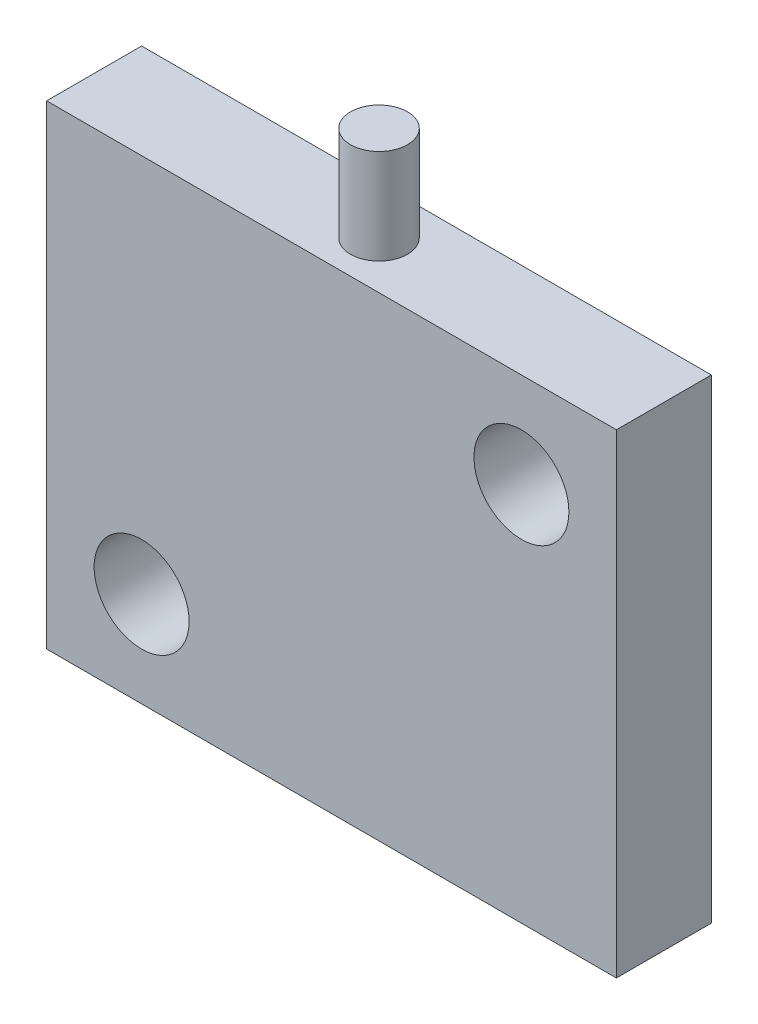
ISO-10303-21;
HEADER;
FILE_DESCRIPTION(('STEP AP214'),'2;1');
FILE_NAME('part.step','',(''),(''),'','','');
FILE_SCHEMA(('AUTOMOTIVE_DESIGN { 1 0 10303 214 1 1 1 1 }'));
ENDSEC;
DATA;
#1=APPLICATION_CONTEXT('core data for automotive mechanical design processes');
#2=APPLICATION_PROTOCOL_DEFINITION('international standard','automotive_design',2000,#1);
#3=PRODUCT_CONTEXT('',#1,'mechanical');
#4=PRODUCT('Part','Part','',(#3));
#5=PRODUCT_RELATED_PRODUCT_CATEGORY('part','',(#4));
#6=PRODUCT_DEFINITION_FORMATION('','',#4);
#7=PRODUCT_DEFINITION_CONTEXT('part definition',#1,'design');
#8=PRODUCT_DEFINITION('design','',#6,#7);
#9=PRODUCT_DEFINITION_SHAPE('','',#8);
#10=(LENGTH_UNIT() NAMED_UNIT(*) SI_UNIT(.MILLI.,.METRE.));
#11=(NAMED_UNIT(*) PLANE_ANGLE_UNIT() SI_UNIT($,.RADIAN.));
#12=(NAMED_UNIT(*) SI_UNIT($,.STERADIAN.) SOLID_ANGLE_UNIT());
#13=UNCERTAINTY_MEASURE_WITH_UNIT(LENGTH_MEASURE(1.E-05),#10,'distance_accuracy_value','');
#14=(GEOMETRIC_REPRESENTATION_CONTEXT(3) GLOBAL_UNCERTAINTY_ASSIGNED_CONTEXT((#13)) GLOBAL_UNIT_ASSIGNED_CONTEXT((#10,
#11,#12)) REPRESENTATION_CONTEXT('',''));
#15=CARTESIAN_POINT('',(0.,0.,0.));
#16=DIRECTION('',(0.,0.,1.));
#17=DIRECTION('',(1.,0.,0.));
#18=AXIS2_PLACEMENT_3D('',#15,#16,#17);
#19=CARTESIAN_POINT('',(30.,30.,10.));
#20=DIRECTION('',(-1.,0.,0.));
#21=DIRECTION('',(0.,-1.,0.));
#22=AXIS2_PLACEMENT_3D('',#19,#20,#21);
#23=PLANE('',#22);
#24=DIRECTION('',(0.,0.,-1.));
#25=VECTOR('',#24,1.);
#26=CARTESIAN_POINT('',(30.,20.,0.));
#27=LINE('',#26,#25);
#28=CARTESIAN_POINT('',(30.,20.,10.));
#29=VERTEX_POINT('',#28);
#30=CARTESIAN_POINT('',(30.,20.,0.));
#31=VERTEX_POINT('',#30);
#32=EDGE_CURVE('E51',#29,#31,#27,.T.);
#33=ORIENTED_EDGE('',*,*,#32,.F.);
#34=DIRECTION('',(0.,1.,0.));
#35=VECTOR('',#34,1.);
#36=CARTESIAN_POINT('',(30.,30.,10.));
#37=LINE('',#36,#35);
#38=CARTESIAN_POINT('',(30.,-30.,10.));
#39=VERTEX_POINT('',#38);
#40=EDGE_CURVE('E80',#39,#29,#37,.T.);
#41=ORIENTED_EDGE('',*,*,#40,.F.);
#42=DIRECTION('',(0.,0.,-1.));
#43=VECTOR('',#42,1.);
#44=CARTESIAN_POINT('',(30.,-30.,10.));
#45=LINE('',#44,#43);
#46=CARTESIAN_POINT('',(30.,-30.,0.));
#47=VERTEX_POINT('',#46);
#48=EDGE_CURVE('E44',#39,#47,#45,.T.);
#49=ORIENTED_EDGE('',*,*,#48,.T.);
#50=DIRECTION('',(0.,1.,0.));
#51=VECTOR('',#50,1.);
#52=CARTESIAN_POINT('',(30.,30.,0.));
#53=LINE('',#52,#51);
#54=EDGE_CURVE('E85',#47,#31,#53,.T.);
#55=ORIENTED_EDGE('',*,*,#54,.T.);
#56=EDGE_LOOP('',(#33,#41,#49,#55));
#57=FACE_BOUND('',#56,.T.);
#58=ADVANCED_FACE('F37',(#57),#23,.F.);
#59=CARTESIAN_POINT('',(-30.,30.,10.));
#60=DIRECTION('',(1.,0.,0.));
#61=DIRECTION('',(0.,1.,0.));
#62=AXIS2_PLACEMENT_3D('',#59,#60,#61);
#63=PLANE('',#62);
#64=DIRECTION('',(0.,0.,1.));
#65=VECTOR('',#64,1.);
#66=CARTESIAN_POINT('',(-30.,20.,0.));
#67=LINE('',#66,#65);
#68=CARTESIAN_POINT('',(-30.,20.,0.));
#69=VERTEX_POINT('',#68);
#70=CARTESIAN_POINT('',(-30.,20.,10.));
#71=VERTEX_POINT('',#70);
#72=EDGE_CURVE('E91',#69,#71,#67,.T.);
#73=ORIENTED_EDGE('',*,*,#72,.F.);
#74=DIRECTION('',(0.,-1.,0.));
#75=VECTOR('',#74,1.);
#76=CARTESIAN_POINT('',(-30.,30.,0.));
#77=LINE('',#76,#75);
#78=CARTESIAN_POINT('',(-30.,-30.,0.));
#79=VERTEX_POINT('',#78);
#80=EDGE_CURVE('E81',#69,#79,#77,.T.);
#81=ORIENTED_EDGE('',*,*,#80,.T.);
#82=DIRECTION('',(0.,0.,-1.));
#83=VECTOR('',#82,1.);
#84=CARTESIAN_POINT('',(-30.,-30.,10.));
#85=LINE('',#84,#83);
#86=CARTESIAN_POINT('',(-30.,-30.,10.));
#87=VERTEX_POINT('',#86);
#88=EDGE_CURVE('E11',#87,#79,#85,.T.);
#89=ORIENTED_EDGE('',*,*,#88,.F.);
#90=DIRECTION('',(0.,-1.,0.));
#91=VECTOR('',#90,1.);
#92=CARTESIAN_POINT('',(-30.,30.,10.));
#93=LINE('',#92,#91);
#94=EDGE_CURVE('E95',#71,#87,#93,.T.);
#95=ORIENTED_EDGE('',*,*,#94,.F.);
#96=EDGE_LOOP('',(#73,#81,#89,#95));
#97=FACE_BOUND('',#96,.T.);
#98=ADVANCED_FACE('F133',(#97),#63,.F.);
#99=CARTESIAN_POINT('',(0.,0.,10.));
#100=DIRECTION('',(0.,0.,1.));
#101=DIRECTION('',(1.,0.,0.));
#102=AXIS2_PLACEMENT_3D('',#99,#100,#101);
#103=PLANE('',#102);
#104=CARTESIAN_POINT('',(20.,10.,10.));
#105=DIRECTION('',(0.,0.,1.));
#106=DIRECTION('',(1.,0.,0.));
#107=AXIS2_PLACEMENT_3D('',#104,#105,#106);
#108=CIRCLE('',#107,5.);
#109=CARTESIAN_POINT('',(25.,10.,10.));
#110=VERTEX_POINT('',#109);
#111=EDGE_CURVE('E115',#110,#110,#108,.T.);
#112=ORIENTED_EDGE('',*,*,#111,.F.);
#113=EDGE_LOOP('',(#112));
#114=FACE_BOUND('',#113,.T.);
#115=CARTESIAN_POINT('',(-20.,-20.,10.));
#116=DIRECTION('',(0.,0.,1.));
#117=DIRECTION('',(1.,0.,0.));
#118=AXIS2_PLACEMENT_3D('',#115,#116,#117);
#119=CIRCLE('',#118,5.);
#120=CARTESIAN_POINT('',(-15.,-20.,10.));
#121=VERTEX_POINT('',#120);
#122=EDGE_CURVE('E112',#121,#121,#119,.T.);
#123=ORIENTED_EDGE('',*,*,#122,.F.);
#124=EDGE_LOOP('',(#123));
#125=FACE_BOUND('',#124,.T.);
#126=ORIENTED_EDGE('',*,*,#40,.T.);
#127=DIRECTION('',(1.,0.,0.));
#128=VECTOR('',#127,1.);
#129=CARTESIAN_POINT('',(0.,20.,10.));
#130=LINE('',#129,#128);
#131=EDGE_CURVE('E88',#71,#29,#130,.T.);
#132=ORIENTED_EDGE('',*,*,#131,.F.);
#133=ORIENTED_EDGE('',*,*,#94,.T.);
#134=DIRECTION('',(1.,0.,0.));
#135=VECTOR('',#134,1.);
#136=CARTESIAN_POINT('',(-30.,-30.,10.));
#137=LINE('',#136,#135);
#138=EDGE_CURVE('E60',#87,#39,#137,.T.);
#139=ORIENTED_EDGE('',*,*,#138,.T.);
#140=EDGE_LOOP('',(#126,#132,#133,#139));
#141=FACE_BOUND('',#140,.T.);
#142=ADVANCED_FACE('F130',(#114,#125,#141),#103,.T.);
#143=CARTESIAN_POINT('',(0.,0.,0.));
#144=DIRECTION('',(0.,0.,1.));
#145=DIRECTION('',(1.,0.,0.));
#146=AXIS2_PLACEMENT_3D('',#143,#144,#145);
#147=PLANE('',#146);
#148=CARTESIAN_POINT('',(20.,10.,0.));
#149=DIRECTION('',(0.,0.,1.));
#150=DIRECTION('',(1.,0.,0.));
#151=AXIS2_PLACEMENT_3D('',#148,#149,#150);
#152=CIRCLE('',#151,5.);
#153=CARTESIAN_POINT('',(25.,10.,0.));
#154=VERTEX_POINT('',#153);
#155=EDGE_CURVE('E101',#154,#154,#152,.T.);
#156=ORIENTED_EDGE('',*,*,#155,.T.);
#157=EDGE_LOOP('',(#156));
#158=FACE_BOUND('',#157,.T.);
#159=CARTESIAN_POINT('',(-20.,-20.,0.));
#160=DIRECTION('',(0.,0.,1.));
#161=DIRECTION('',(1.,0.,0.));
#162=AXIS2_PLACEMENT_3D('',#159,#160,#161);
#163=CIRCLE('',#162,5.);
#164=CARTESIAN_POINT('',(-15.,-20.,0.));
#165=VERTEX_POINT('',#164);
#166=EDGE_CURVE('E109',#165,#165,#163,.T.);
#167=ORIENTED_EDGE('',*,*,#166,.T.);
#168=EDGE_LOOP('',(#167));
#169=FACE_BOUND('',#168,.T.);
#170=DIRECTION('',(-1.,0.,0.));
#171=VECTOR('',#170,1.);
#172=CARTESIAN_POINT('',(0.,20.,0.));
#173=LINE('',#172,#171);
#174=EDGE_CURVE('E87',#31,#69,#173,.T.);
#175=ORIENTED_EDGE('',*,*,#174,.F.);
#176=ORIENTED_EDGE('',*,*,#54,.F.);
#177=DIRECTION('',(1.,0.,0.));
#178=VECTOR('',#177,1.);
#179=CARTESIAN_POINT('',(-30.,-30.,0.));
#180=LINE('',#179,#178);
#181=EDGE_CURVE('E72',#79,#47,#180,.T.);
#182=ORIENTED_EDGE('',*,*,#181,.F.);
#183=ORIENTED_EDGE('',*,*,#80,.F.);
#184=EDGE_LOOP('',(#175,#176,#182,#183));
#185=FACE_BOUND('',#184,.T.);
#186=ADVANCED_FACE('F86',(#158,#169,#185),#147,.F.);
#187=CARTESIAN_POINT('',(-30.,-30.,10.));
#188=DIRECTION('',(0.,1.,0.));
#189=DIRECTION('',(0.,0.,1.));
#190=AXIS2_PLACEMENT_3D('',#187,#188,#189);
#191=PLANE('',#190);
#192=ORIENTED_EDGE('',*,*,#181,.T.);
#193=ORIENTED_EDGE('',*,*,#48,.F.);
#194=ORIENTED_EDGE('',*,*,#138,.F.);
#195=ORIENTED_EDGE('',*,*,#88,.T.);
#196=EDGE_LOOP('',(#192,#193,#194,#195));
#197=FACE_BOUND('',#196,.T.);
#198=ADVANCED_FACE('F74',(#197),#191,.F.);
#199=CARTESIAN_POINT('',(0.,20.,5.));
#200=DIRECTION('',(0.,1.,0.));
#201=DIRECTION('',(0.,0.,1.));
#202=AXIS2_PLACEMENT_3D('',#199,#200,#201);
#203=CYLINDRICAL_SURFACE('',#202,3.);
#204=CARTESIAN_POINT('',(0.,20.,5.));
#205=DIRECTION('',(0.,1.,0.));
#206=DIRECTION('',(0.,0.,1.));
#207=AXIS2_PLACEMENT_3D('',#204,#205,#206);
#208=CIRCLE('',#207,3.);
#209=CARTESIAN_POINT('',(0.,20.,8.));
#210=VERTEX_POINT('',#209);
#211=EDGE_CURVE('E100',#210,#210,#208,.T.);
#212=ORIENTED_EDGE('',*,*,#211,.T.);
#213=EDGE_LOOP('',(#212));
#214=FACE_BOUND('',#213,.T.);
#215=CARTESIAN_POINT('',(0.,30.,5.));
#216=DIRECTION('',(0.,1.,0.));
#217=DIRECTION('',(0.,0.,1.));
#218=AXIS2_PLACEMENT_3D('',#215,#216,#217);
#219=CIRCLE('',#218,3.);
#220=CARTESIAN_POINT('',(0.,30.,8.));
#221=VERTEX_POINT('',#220);
#222=EDGE_CURVE('E98',#221,#221,#219,.T.);
#223=ORIENTED_EDGE('',*,*,#222,.F.);
#224=EDGE_LOOP('',(#223));
#225=FACE_BOUND('',#224,.T.);
#226=ADVANCED_FACE('F161',(#214,#225),#203,.T.);
#227=CARTESIAN_POINT('',(0.,20.,0.));
#228=DIRECTION('',(0.,1.,0.));
#229=DIRECTION('',(0.,0.,1.));
#230=AXIS2_PLACEMENT_3D('',#227,#228,#229);
#231=PLANE('',#230);
#232=ORIENTED_EDGE('',*,*,#211,.F.);
#233=EDGE_LOOP('',(#232));
#234=FACE_BOUND('',#233,.T.);
#235=ORIENTED_EDGE('',*,*,#32,.T.);
#236=ORIENTED_EDGE('',*,*,#174,.T.);
#237=ORIENTED_EDGE('',*,*,#72,.T.);
#238=ORIENTED_EDGE('',*,*,#131,.T.);
#239=EDGE_LOOP('',(#235,#236,#237,#238));
#240=FACE_BOUND('',#239,.T.);
#241=ADVANCED_FACE('F143',(#234,#240),#231,.T.);
#242=CARTESIAN_POINT('',(-30.,30.,10.));
#243=DIRECTION('',(0.,-1.,0.));
#244=DIRECTION('',(0.,0.,-1.));
#245=AXIS2_PLACEMENT_3D('',#242,#243,#244);
#246=PLANE('',#245);
#247=ORIENTED_EDGE('',*,*,#222,.T.);
#248=EDGE_LOOP('',(#247));
#249=FACE_BOUND('',#248,.T.);
#250=ADVANCED_FACE('F152',(#249),#246,.F.);
#251=CARTESIAN_POINT('',(-20.,-20.,0.));
#252=DIRECTION('',(0.,0.,1.));
#253=DIRECTION('',(1.,0.,0.));
#254=AXIS2_PLACEMENT_3D('',#251,#252,#253);
#255=CYLINDRICAL_SURFACE('',#254,5.);
#256=ORIENTED_EDGE('',*,*,#166,.F.);
#257=EDGE_LOOP('',(#256));
#258=FACE_BOUND('',#257,.T.);
#259=ORIENTED_EDGE('',*,*,#122,.T.);
#260=EDGE_LOOP('',(#259));
#261=FACE_BOUND('',#260,.T.);
#262=ADVANCED_FACE('F126',(#258,#261),#255,.F.);
#263=CARTESIAN_POINT('',(20.,10.,0.));
#264=DIRECTION('',(0.,0.,1.));
#265=DIRECTION('',(1.,0.,0.));
#266=AXIS2_PLACEMENT_3D('',#263,#264,#265);
#267=CYLINDRICAL_SURFACE('',#266,5.);
#268=ORIENTED_EDGE('',*,*,#155,.F.);
#269=EDGE_LOOP('',(#268));
#270=FACE_BOUND('',#269,.T.);
#271=ORIENTED_EDGE('',*,*,#111,.T.);
#272=EDGE_LOOP('',(#271));
#273=FACE_BOUND('',#272,.T.);
#274=ADVANCED_FACE('F123',(#270,#273),#267,.F.);
#275=CLOSED_SHELL('',(#58,#98,#142,#186,#198,#226,#241,#250,#262,#274));
#276=MANIFOLD_SOLID_BREP('B2',#275);
#277=ADVANCED_BREP_SHAPE_REPRESENTATION('',(#18,#276),#14);
#278=SHAPE_DEFINITION_REPRESENTATION(#9,#277);
ENDSEC;
END-ISO-10303-21;
